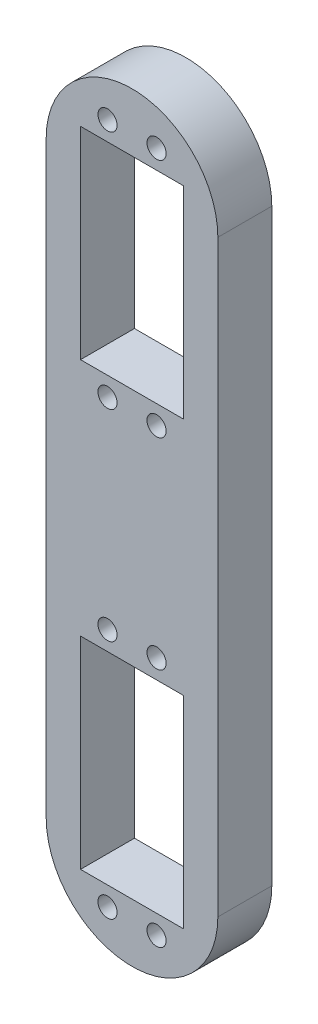
ISO-10303-21;
HEADER;
FILE_DESCRIPTION(('STEP AP214'),'2;1');
FILE_NAME('part.step','',(''),(''),'','','');
FILE_SCHEMA(('AUTOMOTIVE_DESIGN { 1 0 10303 214 1 1 1 1 }'));
ENDSEC;
DATA;
#1=APPLICATION_CONTEXT('core data for automotive mechanical design processes');
#2=APPLICATION_PROTOCOL_DEFINITION('international standard','automotive_design',2000,#1);
#3=PRODUCT_CONTEXT('',#1,'mechanical');
#4=PRODUCT('Part','Part','',(#3));
#5=PRODUCT_RELATED_PRODUCT_CATEGORY('part','',(#4));
#6=PRODUCT_DEFINITION_FORMATION('','',#4);
#7=PRODUCT_DEFINITION_CONTEXT('part definition',#1,'design');
#8=PRODUCT_DEFINITION('design','',#6,#7);
#9=PRODUCT_DEFINITION_SHAPE('','',#8);
#10=(LENGTH_UNIT() NAMED_UNIT(*) SI_UNIT(.MILLI.,.METRE.));
#11=(NAMED_UNIT(*) PLANE_ANGLE_UNIT() SI_UNIT($,.RADIAN.));
#12=(NAMED_UNIT(*) SI_UNIT($,.STERADIAN.) SOLID_ANGLE_UNIT());
#13=UNCERTAINTY_MEASURE_WITH_UNIT(LENGTH_MEASURE(1.E-05),#10,'distance_accuracy_value','');
#14=(GEOMETRIC_REPRESENTATION_CONTEXT(3) GLOBAL_UNCERTAINTY_ASSIGNED_CONTEXT((#13)) GLOBAL_UNIT_ASSIGNED_CONTEXT((#10,
#11,#12)) REPRESENTATION_CONTEXT('',''));
#15=CARTESIAN_POINT('',(0.,0.,0.));
#16=DIRECTION('',(0.,0.,1.));
#17=DIRECTION('',(1.,0.,0.));
#18=AXIS2_PLACEMENT_3D('',#15,#16,#17);
#19=CARTESIAN_POINT('',(-2.50000000000001,-50.,11.));
#20=DIRECTION('',(0.,0.,1.));
#21=DIRECTION('',(1.,0.,0.));
#22=AXIS2_PLACEMENT_3D('',#19,#20,#21);
#23=PLANE('',#22);
#24=CARTESIAN_POINT('',(2.49999999999998,-10.5,11.));
#25=DIRECTION('',(0.,0.,1.));
#26=DIRECTION('',(1.,0.,0.));
#27=AXIS2_PLACEMENT_3D('',#24,#25,#26);
#28=CIRCLE('',#27,1.95);
#29=CARTESIAN_POINT('',(4.44999999999998,-10.5,11.));
#30=VERTEX_POINT('',#29);
#31=EDGE_CURVE('E407',#30,#30,#28,.T.);
#32=ORIENTED_EDGE('',*,*,#31,.F.);
#33=EDGE_LOOP('',(#32));
#34=FACE_BOUND('',#33,.T.);
#35=CARTESIAN_POINT('',(-7.50000000000001,30.5,11.));
#36=DIRECTION('',(0.,0.,1.));
#37=DIRECTION('',(-1.,0.,0.));
#38=AXIS2_PLACEMENT_3D('',#35,#36,#37);
#39=CIRCLE('',#38,1.95);
#40=CARTESIAN_POINT('',(-9.45000000000001,30.5,11.));
#41=VERTEX_POINT('',#40);
#42=EDGE_CURVE('E406',#41,#41,#39,.T.);
#43=ORIENTED_EDGE('',*,*,#42,.F.);
#44=EDGE_LOOP('',(#43));
#45=FACE_BOUND('',#44,.T.);
#46=CARTESIAN_POINT('',(2.49999999999999,30.5,11.));
#47=DIRECTION('',(0.,0.,1.));
#48=DIRECTION('',(-1.,0.,0.));
#49=AXIS2_PLACEMENT_3D('',#46,#47,#48);
#50=CIRCLE('',#49,1.95);
#51=CARTESIAN_POINT('',(0.549999999999991,30.5,11.));
#52=VERTEX_POINT('',#51);
#53=EDGE_CURVE('E423',#52,#52,#50,.T.);
#54=ORIENTED_EDGE('',*,*,#53,.F.);
#55=EDGE_LOOP('',(#54));
#56=FACE_BOUND('',#55,.T.);
#57=CARTESIAN_POINT('',(2.49999999999999,79.5,11.));
#58=DIRECTION('',(0.,0.,1.));
#59=DIRECTION('',(1.,0.,0.));
#60=AXIS2_PLACEMENT_3D('',#57,#58,#59);
#61=CIRCLE('',#60,1.95);
#62=CARTESIAN_POINT('',(4.44999999999999,79.5,11.));
#63=VERTEX_POINT('',#62);
#64=EDGE_CURVE('E422',#63,#63,#61,.T.);
#65=ORIENTED_EDGE('',*,*,#64,.F.);
#66=EDGE_LOOP('',(#65));
#67=FACE_BOUND('',#66,.T.);
#68=CARTESIAN_POINT('',(-7.50000000000004,-59.4999999999999,11.));
#69=DIRECTION('',(0.,0.,1.));
#70=DIRECTION('',(-1.,0.,0.));
#71=AXIS2_PLACEMENT_3D('',#68,#69,#70);
#72=CIRCLE('',#71,1.95000000000001);
#73=CARTESIAN_POINT('',(-9.45000000000005,-59.4999999999999,11.));
#74=VERTEX_POINT('',#73);
#75=EDGE_CURVE('E378',#74,#74,#72,.T.);
#76=ORIENTED_EDGE('',*,*,#75,.F.);
#77=EDGE_LOOP('',(#76));
#78=FACE_BOUND('',#77,.T.);
#79=CARTESIAN_POINT('',(2.49999999999996,-59.4999999999999,11.));
#80=DIRECTION('',(0.,0.,1.));
#81=DIRECTION('',(-1.,0.,0.));
#82=AXIS2_PLACEMENT_3D('',#79,#80,#81);
#83=CIRCLE('',#82,1.95000000000001);
#84=CARTESIAN_POINT('',(0.549999999999956,-59.4999999999999,11.));
#85=VERTEX_POINT('',#84);
#86=EDGE_CURVE('E386',#85,#85,#83,.T.);
#87=ORIENTED_EDGE('',*,*,#86,.F.);
#88=EDGE_LOOP('',(#87));
#89=FACE_BOUND('',#88,.T.);
#90=CARTESIAN_POINT('',(-7.50000000000002,-10.5,11.));
#91=DIRECTION('',(0.,0.,1.));
#92=DIRECTION('',(1.,0.,0.));
#93=AXIS2_PLACEMENT_3D('',#90,#91,#92);
#94=CIRCLE('',#93,1.95);
#95=CARTESIAN_POINT('',(-5.55000000000002,-10.5,11.));
#96=VERTEX_POINT('',#95);
#97=EDGE_CURVE('E394',#96,#96,#94,.T.);
#98=ORIENTED_EDGE('',*,*,#97,.F.);
#99=EDGE_LOOP('',(#98));
#100=FACE_BOUND('',#99,.T.);
#101=CARTESIAN_POINT('',(-7.50000000000001,79.5,11.));
#102=DIRECTION('',(0.,0.,1.));
#103=DIRECTION('',(1.,0.,0.));
#104=AXIS2_PLACEMENT_3D('',#101,#102,#103);
#105=CIRCLE('',#104,1.95);
#106=CARTESIAN_POINT('',(-5.55000000000001,79.5,11.));
#107=VERTEX_POINT('',#106);
#108=EDGE_CURVE('E427',#107,#107,#105,.T.);
#109=ORIENTED_EDGE('',*,*,#108,.F.);
#110=EDGE_LOOP('',(#109));
#111=FACE_BOUND('',#110,.T.);
#112=DIRECTION('',(1.,0.,0.));
#113=VECTOR('',#112,1.);
#114=CARTESIAN_POINT('',(0.,-14.4,11.));
#115=LINE('',#114,#113);
#116=CARTESIAN_POINT('',(-13.,-14.4,11.));
#117=VERTEX_POINT('',#116);
#118=CARTESIAN_POINT('',(8.,-14.4,11.));
#119=VERTEX_POINT('',#118);
#120=EDGE_CURVE('E149',#117,#119,#115,.T.);
#121=ORIENTED_EDGE('',*,*,#120,.T.);
#122=DIRECTION('',(0.,-1.,0.));
#123=VECTOR('',#122,1.);
#124=CARTESIAN_POINT('',(8.,0.,11.));
#125=LINE('',#124,#123);
#126=CARTESIAN_POINT('',(7.99999999999998,-55.6,11.));
#127=VERTEX_POINT('',#126);
#128=EDGE_CURVE('E135',#119,#127,#125,.T.);
#129=ORIENTED_EDGE('',*,*,#128,.T.);
#130=DIRECTION('',(1.,0.,0.));
#131=VECTOR('',#130,1.);
#132=CARTESIAN_POINT('',(0.,-55.6,11.));
#133=LINE('',#132,#131);
#134=CARTESIAN_POINT('',(-13.,-55.6,11.));
#135=VERTEX_POINT('',#134);
#136=EDGE_CURVE('E169',#135,#127,#133,.T.);
#137=ORIENTED_EDGE('',*,*,#136,.F.);
#138=DIRECTION('',(0.,1.,0.));
#139=VECTOR('',#138,1.);
#140=CARTESIAN_POINT('',(-13.,0.,11.));
#141=LINE('',#140,#139);
#142=EDGE_CURVE('E157',#135,#117,#141,.T.);
#143=ORIENTED_EDGE('',*,*,#142,.T.);
#144=EDGE_LOOP('',(#121,#129,#137,#143));
#145=FACE_BOUND('',#144,.T.);
#146=CARTESIAN_POINT('',(-2.50000000000001,-50.,11.));
#147=DIRECTION('',(0.,0.,1.));
#148=DIRECTION('',(1.,0.,0.));
#149=AXIS2_PLACEMENT_3D('',#146,#147,#148);
#150=CIRCLE('',#149,17.5);
#151=CARTESIAN_POINT('',(-20.,-50.,11.));
#152=VERTEX_POINT('',#151);
#153=CARTESIAN_POINT('',(15.,-50.,11.));
#154=VERTEX_POINT('',#153);
#155=EDGE_CURVE('E225',#152,#154,#150,.T.);
#156=ORIENTED_EDGE('',*,*,#155,.T.);
#157=DIRECTION('',(0.,1.,0.));
#158=VECTOR('',#157,1.);
#159=CARTESIAN_POINT('',(15.,70.,11.));
#160=LINE('',#159,#158);
#161=CARTESIAN_POINT('',(15.,70.,11.));
#162=VERTEX_POINT('',#161);
#163=EDGE_CURVE('E229',#154,#162,#160,.T.);
#164=ORIENTED_EDGE('',*,*,#163,.T.);
#165=CARTESIAN_POINT('',(-2.50000000000001,70.,11.));
#166=DIRECTION('',(0.,0.,1.));
#167=DIRECTION('',(1.,0.,0.));
#168=AXIS2_PLACEMENT_3D('',#165,#166,#167);
#169=CIRCLE('',#168,17.5);
#170=CARTESIAN_POINT('',(-20.,70.,11.));
#171=VERTEX_POINT('',#170);
#172=EDGE_CURVE('E233',#162,#171,#169,.T.);
#173=ORIENTED_EDGE('',*,*,#172,.T.);
#174=DIRECTION('',(0.,-1.,0.));
#175=VECTOR('',#174,1.);
#176=CARTESIAN_POINT('',(-20.,70.,11.));
#177=LINE('',#176,#175);
#178=EDGE_CURVE('E236',#171,#152,#177,.T.);
#179=ORIENTED_EDGE('',*,*,#178,.T.);
#180=EDGE_LOOP('',(#156,#164,#173,#179));
#181=FACE_BOUND('',#180,.T.);
#182=DIRECTION('',(1.,0.,0.));
#183=VECTOR('',#182,1.);
#184=CARTESIAN_POINT('',(0.,75.6,11.));
#185=LINE('',#184,#183);
#186=CARTESIAN_POINT('',(-13.,75.6,11.));
#187=VERTEX_POINT('',#186);
#188=CARTESIAN_POINT('',(8.,75.6,11.));
#189=VERTEX_POINT('',#188);
#190=EDGE_CURVE('E186',#187,#189,#185,.T.);
#191=ORIENTED_EDGE('',*,*,#190,.T.);
#192=DIRECTION('',(0.,1.,0.));
#193=VECTOR('',#192,1.);
#194=CARTESIAN_POINT('',(7.99999999999999,75.5,11.));
#195=LINE('',#194,#193);
#196=CARTESIAN_POINT('',(8.00000000000001,34.4,11.));
#197=VERTEX_POINT('',#196);
#198=EDGE_CURVE('E216',#197,#189,#195,.T.);
#199=ORIENTED_EDGE('',*,*,#198,.F.);
#200=DIRECTION('',(1.,0.,0.));
#201=VECTOR('',#200,1.);
#202=CARTESIAN_POINT('',(0.,34.4,11.));
#203=LINE('',#202,#201);
#204=CARTESIAN_POINT('',(-13.,34.4,11.));
#205=VERTEX_POINT('',#204);
#206=EDGE_CURVE('E180',#205,#197,#203,.T.);
#207=ORIENTED_EDGE('',*,*,#206,.F.);
#208=DIRECTION('',(0.,-1.,0.));
#209=VECTOR('',#208,1.);
#210=CARTESIAN_POINT('',(-13.,75.5,11.));
#211=LINE('',#210,#209);
#212=EDGE_CURVE('E213',#187,#205,#211,.T.);
#213=ORIENTED_EDGE('',*,*,#212,.F.);
#214=EDGE_LOOP('',(#191,#199,#207,#213));
#215=FACE_BOUND('',#214,.T.);
#216=ADVANCED_FACE('F44',(#34,#45,#56,#67,#78,#89,#100,#111,#145,#181,#215),#23,.T.);
#217=CARTESIAN_POINT('',(-2.50000000000001,-50.,0.));
#218=DIRECTION('',(0.,0.,1.));
#219=DIRECTION('',(1.,0.,0.));
#220=AXIS2_PLACEMENT_3D('',#217,#218,#219);
#221=PLANE('',#220);
#222=CARTESIAN_POINT('',(2.49999999999998,-10.5,0.));
#223=DIRECTION('',(0.,0.,1.));
#224=DIRECTION('',(1.,0.,0.));
#225=AXIS2_PLACEMENT_3D('',#222,#223,#224);
#226=CIRCLE('',#225,1.95);
#227=CARTESIAN_POINT('',(4.44999999999998,-10.5,0.));
#228=VERTEX_POINT('',#227);
#229=EDGE_CURVE('E397',#228,#228,#226,.F.);
#230=ORIENTED_EDGE('',*,*,#229,.F.);
#231=EDGE_LOOP('',(#230));
#232=FACE_BOUND('',#231,.T.);
#233=CARTESIAN_POINT('',(-7.50000000000001,30.5,0.));
#234=DIRECTION('',(0.,0.,1.));
#235=DIRECTION('',(1.,0.,0.));
#236=AXIS2_PLACEMENT_3D('',#233,#234,#235);
#237=CIRCLE('',#236,1.95);
#238=CARTESIAN_POINT('',(-5.55000000000001,30.5,0.));
#239=VERTEX_POINT('',#238);
#240=EDGE_CURVE('E402',#239,#239,#237,.F.);
#241=ORIENTED_EDGE('',*,*,#240,.F.);
#242=EDGE_LOOP('',(#241));
#243=FACE_BOUND('',#242,.T.);
#244=CARTESIAN_POINT('',(2.49999999999999,30.5,0.));
#245=DIRECTION('',(0.,0.,1.));
#246=DIRECTION('',(1.,0.,0.));
#247=AXIS2_PLACEMENT_3D('',#244,#245,#246);
#248=CIRCLE('',#247,1.95);
#249=CARTESIAN_POINT('',(4.44999999999999,30.5,0.));
#250=VERTEX_POINT('',#249);
#251=EDGE_CURVE('E411',#250,#250,#248,.F.);
#252=ORIENTED_EDGE('',*,*,#251,.F.);
#253=EDGE_LOOP('',(#252));
#254=FACE_BOUND('',#253,.T.);
#255=CARTESIAN_POINT('',(2.49999999999999,79.5,0.));
#256=DIRECTION('',(0.,0.,1.));
#257=DIRECTION('',(1.,0.,0.));
#258=AXIS2_PLACEMENT_3D('',#255,#256,#257);
#259=CIRCLE('',#258,1.95);
#260=CARTESIAN_POINT('',(4.44999999999999,79.5,0.));
#261=VERTEX_POINT('',#260);
#262=EDGE_CURVE('E418',#261,#261,#259,.F.);
#263=ORIENTED_EDGE('',*,*,#262,.F.);
#264=EDGE_LOOP('',(#263));
#265=FACE_BOUND('',#264,.T.);
#266=CARTESIAN_POINT('',(-7.50000000000004,-59.4999999999999,0.));
#267=DIRECTION('',(0.,0.,1.));
#268=DIRECTION('',(1.,0.,0.));
#269=AXIS2_PLACEMENT_3D('',#266,#267,#268);
#270=CIRCLE('',#269,1.95000000000001);
#271=CARTESIAN_POINT('',(-5.55000000000003,-59.4999999999999,0.));
#272=VERTEX_POINT('',#271);
#273=EDGE_CURVE('E375',#272,#272,#270,.F.);
#274=ORIENTED_EDGE('',*,*,#273,.F.);
#275=EDGE_LOOP('',(#274));
#276=FACE_BOUND('',#275,.T.);
#277=CARTESIAN_POINT('',(2.49999999999996,-59.4999999999999,0.));
#278=DIRECTION('',(0.,0.,1.));
#279=DIRECTION('',(1.,0.,0.));
#280=AXIS2_PLACEMENT_3D('',#277,#278,#279);
#281=CIRCLE('',#280,1.95000000000001);
#282=CARTESIAN_POINT('',(4.44999999999997,-59.4999999999999,0.));
#283=VERTEX_POINT('',#282);
#284=EDGE_CURVE('E381',#283,#283,#281,.F.);
#285=ORIENTED_EDGE('',*,*,#284,.F.);
#286=EDGE_LOOP('',(#285));
#287=FACE_BOUND('',#286,.T.);
#288=CARTESIAN_POINT('',(-7.50000000000002,-10.5,0.));
#289=DIRECTION('',(0.,0.,1.));
#290=DIRECTION('',(1.,0.,0.));
#291=AXIS2_PLACEMENT_3D('',#288,#289,#290);
#292=CIRCLE('',#291,1.95);
#293=CARTESIAN_POINT('',(-5.55000000000002,-10.5,0.));
#294=VERTEX_POINT('',#293);
#295=EDGE_CURVE('E390',#294,#294,#292,.F.);
#296=ORIENTED_EDGE('',*,*,#295,.F.);
#297=EDGE_LOOP('',(#296));
#298=FACE_BOUND('',#297,.T.);
#299=CARTESIAN_POINT('',(-7.50000000000001,79.5,0.));
#300=DIRECTION('',(0.,0.,1.));
#301=DIRECTION('',(1.,0.,0.));
#302=AXIS2_PLACEMENT_3D('',#299,#300,#301);
#303=CIRCLE('',#302,1.95);
#304=CARTESIAN_POINT('',(-5.55000000000001,79.5,0.));
#305=VERTEX_POINT('',#304);
#306=EDGE_CURVE('E171',#305,#305,#303,.F.);
#307=ORIENTED_EDGE('',*,*,#306,.F.);
#308=EDGE_LOOP('',(#307));
#309=FACE_BOUND('',#308,.T.);
#310=DIRECTION('',(0.,-1.,0.));
#311=VECTOR('',#310,1.);
#312=CARTESIAN_POINT('',(8.,0.,0.));
#313=LINE('',#312,#311);
#314=CARTESIAN_POINT('',(8.,-14.4,0.));
#315=VERTEX_POINT('',#314);
#316=CARTESIAN_POINT('',(7.99999999999998,-55.6,0.));
#317=VERTEX_POINT('',#316);
#318=EDGE_CURVE('E159',#315,#317,#313,.T.);
#319=ORIENTED_EDGE('',*,*,#318,.F.);
#320=DIRECTION('',(1.,0.,0.));
#321=VECTOR('',#320,1.);
#322=CARTESIAN_POINT('',(0.,-14.4,0.));
#323=LINE('',#322,#321);
#324=CARTESIAN_POINT('',(-13.,-14.4,0.));
#325=VERTEX_POINT('',#324);
#326=EDGE_CURVE('E152',#325,#315,#323,.T.);
#327=ORIENTED_EDGE('',*,*,#326,.F.);
#328=DIRECTION('',(0.,1.,0.));
#329=VECTOR('',#328,1.);
#330=CARTESIAN_POINT('',(-13.,0.,0.));
#331=LINE('',#330,#329);
#332=CARTESIAN_POINT('',(-13.,-55.6,0.));
#333=VERTEX_POINT('',#332);
#334=EDGE_CURVE('E165',#333,#325,#331,.T.);
#335=ORIENTED_EDGE('',*,*,#334,.F.);
#336=DIRECTION('',(1.,0.,0.));
#337=VECTOR('',#336,1.);
#338=CARTESIAN_POINT('',(0.,-55.6,0.));
#339=LINE('',#338,#337);
#340=EDGE_CURVE('E68',#333,#317,#339,.T.);
#341=ORIENTED_EDGE('',*,*,#340,.T.);
#342=EDGE_LOOP('',(#319,#327,#335,#341));
#343=FACE_BOUND('',#342,.T.);
#344=CARTESIAN_POINT('',(-2.50000000000001,-50.,0.));
#345=DIRECTION('',(0.,0.,1.));
#346=DIRECTION('',(1.,0.,0.));
#347=AXIS2_PLACEMENT_3D('',#344,#345,#346);
#348=CIRCLE('',#347,17.5);
#349=CARTESIAN_POINT('',(-20.,-50.,0.));
#350=VERTEX_POINT('',#349);
#351=CARTESIAN_POINT('',(15.,-50.,0.));
#352=VERTEX_POINT('',#351);
#353=EDGE_CURVE('E220',#350,#352,#348,.T.);
#354=ORIENTED_EDGE('',*,*,#353,.F.);
#355=DIRECTION('',(0.,-1.,0.));
#356=VECTOR('',#355,1.);
#357=CARTESIAN_POINT('',(-20.,70.,0.));
#358=LINE('',#357,#356);
#359=CARTESIAN_POINT('',(-20.,70.,0.));
#360=VERTEX_POINT('',#359);
#361=EDGE_CURVE('E230',#360,#350,#358,.T.);
#362=ORIENTED_EDGE('',*,*,#361,.F.);
#363=CARTESIAN_POINT('',(-2.50000000000001,70.,0.));
#364=DIRECTION('',(0.,0.,1.));
#365=DIRECTION('',(1.,0.,0.));
#366=AXIS2_PLACEMENT_3D('',#363,#364,#365);
#367=CIRCLE('',#366,17.5);
#368=CARTESIAN_POINT('',(15.,70.,0.));
#369=VERTEX_POINT('',#368);
#370=EDGE_CURVE('E246',#369,#360,#367,.T.);
#371=ORIENTED_EDGE('',*,*,#370,.F.);
#372=DIRECTION('',(0.,1.,0.));
#373=VECTOR('',#372,1.);
#374=CARTESIAN_POINT('',(15.,70.,0.));
#375=LINE('',#374,#373);
#376=EDGE_CURVE('E243',#352,#369,#375,.T.);
#377=ORIENTED_EDGE('',*,*,#376,.F.);
#378=EDGE_LOOP('',(#354,#362,#371,#377));
#379=FACE_BOUND('',#378,.T.);
#380=DIRECTION('',(0.,1.,0.));
#381=VECTOR('',#380,1.);
#382=CARTESIAN_POINT('',(7.99999999999999,75.5,0.));
#383=LINE('',#382,#381);
#384=CARTESIAN_POINT('',(8.00000000000001,34.4,0.));
#385=VERTEX_POINT('',#384);
#386=CARTESIAN_POINT('',(8.,75.6,0.));
#387=VERTEX_POINT('',#386);
#388=EDGE_CURVE('E217',#385,#387,#383,.T.);
#389=ORIENTED_EDGE('',*,*,#388,.T.);
#390=DIRECTION('',(1.,0.,0.));
#391=VECTOR('',#390,1.);
#392=CARTESIAN_POINT('',(0.,75.6,0.));
#393=LINE('',#392,#391);
#394=CARTESIAN_POINT('',(-13.,75.6,0.));
#395=VERTEX_POINT('',#394);
#396=EDGE_CURVE('E181',#395,#387,#393,.T.);
#397=ORIENTED_EDGE('',*,*,#396,.F.);
#398=DIRECTION('',(0.,-1.,0.));
#399=VECTOR('',#398,1.);
#400=CARTESIAN_POINT('',(-13.,75.5,0.));
#401=LINE('',#400,#399);
#402=CARTESIAN_POINT('',(-13.,34.4,0.));
#403=VERTEX_POINT('',#402);
#404=EDGE_CURVE('E195',#395,#403,#401,.T.);
#405=ORIENTED_EDGE('',*,*,#404,.T.);
#406=DIRECTION('',(1.,0.,0.));
#407=VECTOR('',#406,1.);
#408=CARTESIAN_POINT('',(0.,34.4,0.));
#409=LINE('',#408,#407);
#410=EDGE_CURVE('E199',#403,#385,#409,.T.);
#411=ORIENTED_EDGE('',*,*,#410,.T.);
#412=EDGE_LOOP('',(#389,#397,#405,#411));
#413=FACE_BOUND('',#412,.T.);
#414=ADVANCED_FACE('F269',(#232,#243,#254,#265,#276,#287,#298,#309,#343,#379,#413),#221,.F.);
#415=CARTESIAN_POINT('',(-2.50000000000001,-50.,11.));
#416=DIRECTION('',(0.,0.,-1.));
#417=DIRECTION('',(-1.,0.,0.));
#418=AXIS2_PLACEMENT_3D('',#415,#416,#417);
#419=CYLINDRICAL_SURFACE('',#418,17.5);
#420=ORIENTED_EDGE('',*,*,#353,.T.);
#421=DIRECTION('',(0.,0.,-1.));
#422=VECTOR('',#421,1.);
#423=CARTESIAN_POINT('',(15.,-50.,11.));
#424=LINE('',#423,#422);
#425=EDGE_CURVE('E11',#154,#352,#424,.T.);
#426=ORIENTED_EDGE('',*,*,#425,.F.);
#427=ORIENTED_EDGE('',*,*,#155,.F.);
#428=DIRECTION('',(0.,0.,-1.));
#429=VECTOR('',#428,1.);
#430=CARTESIAN_POINT('',(-20.,-50.,11.));
#431=LINE('',#430,#429);
#432=EDGE_CURVE('E239',#152,#350,#431,.T.);
#433=ORIENTED_EDGE('',*,*,#432,.T.);
#434=EDGE_LOOP('',(#420,#426,#427,#433));
#435=FACE_BOUND('',#434,.T.);
#436=ADVANCED_FACE('F46',(#435),#419,.T.);
#437=CARTESIAN_POINT('',(15.,70.,11.));
#438=DIRECTION('',(-1.,0.,0.));
#439=DIRECTION('',(0.,0.,1.));
#440=AXIS2_PLACEMENT_3D('',#437,#438,#439);
#441=PLANE('',#440);
#442=ORIENTED_EDGE('',*,*,#376,.T.);
#443=DIRECTION('',(0.,0.,-1.));
#444=VECTOR('',#443,1.);
#445=CARTESIAN_POINT('',(15.,70.,11.));
#446=LINE('',#445,#444);
#447=EDGE_CURVE('E53',#162,#369,#446,.T.);
#448=ORIENTED_EDGE('',*,*,#447,.F.);
#449=ORIENTED_EDGE('',*,*,#163,.F.);
#450=ORIENTED_EDGE('',*,*,#425,.T.);
#451=EDGE_LOOP('',(#442,#448,#449,#450));
#452=FACE_BOUND('',#451,.T.);
#453=ADVANCED_FACE('F279',(#452),#441,.F.);
#454=CARTESIAN_POINT('',(-2.50000000000001,70.,11.));
#455=DIRECTION('',(0.,0.,-1.));
#456=DIRECTION('',(-1.,0.,0.));
#457=AXIS2_PLACEMENT_3D('',#454,#455,#456);
#458=CYLINDRICAL_SURFACE('',#457,17.5);
#459=ORIENTED_EDGE('',*,*,#370,.T.);
#460=DIRECTION('',(0.,0.,-1.));
#461=VECTOR('',#460,1.);
#462=CARTESIAN_POINT('',(-20.,70.,11.));
#463=LINE('',#462,#461);
#464=EDGE_CURVE('E254',#171,#360,#463,.T.);
#465=ORIENTED_EDGE('',*,*,#464,.F.);
#466=ORIENTED_EDGE('',*,*,#172,.F.);
#467=ORIENTED_EDGE('',*,*,#447,.T.);
#468=EDGE_LOOP('',(#459,#465,#466,#467));
#469=FACE_BOUND('',#468,.T.);
#470=ADVANCED_FACE('F263',(#469),#458,.T.);
#471=CARTESIAN_POINT('',(-20.,70.,11.));
#472=DIRECTION('',(1.,0.,0.));
#473=DIRECTION('',(0.,0.,-1.));
#474=AXIS2_PLACEMENT_3D('',#471,#472,#473);
#475=PLANE('',#474);
#476=ORIENTED_EDGE('',*,*,#361,.T.);
#477=ORIENTED_EDGE('',*,*,#432,.F.);
#478=ORIENTED_EDGE('',*,*,#178,.F.);
#479=ORIENTED_EDGE('',*,*,#464,.T.);
#480=EDGE_LOOP('',(#476,#477,#478,#479));
#481=FACE_BOUND('',#480,.T.);
#482=ADVANCED_FACE('F273',(#481),#475,.F.);
#483=CARTESIAN_POINT('',(-13.,75.5,11.));
#484=DIRECTION('',(1.,0.,0.));
#485=DIRECTION('',(0.,1.,0.));
#486=AXIS2_PLACEMENT_3D('',#483,#484,#485);
#487=PLANE('',#486);
#488=ORIENTED_EDGE('',*,*,#404,.F.);
#489=DIRECTION('',(0.,0.,1.));
#490=VECTOR('',#489,1.);
#491=CARTESIAN_POINT('',(-13.,75.6,0.));
#492=LINE('',#491,#490);
#493=EDGE_CURVE('E191',#395,#187,#492,.T.);
#494=ORIENTED_EDGE('',*,*,#493,.T.);
#495=ORIENTED_EDGE('',*,*,#212,.T.);
#496=DIRECTION('',(0.,0.,1.));
#497=VECTOR('',#496,1.);
#498=CARTESIAN_POINT('',(-13.,34.4,0.));
#499=LINE('',#498,#497);
#500=EDGE_CURVE('E203',#403,#205,#499,.T.);
#501=ORIENTED_EDGE('',*,*,#500,.F.);
#502=EDGE_LOOP('',(#488,#494,#495,#501));
#503=FACE_BOUND('',#502,.T.);
#504=ADVANCED_FACE('F297',(#503),#487,.T.);
#505=CARTESIAN_POINT('',(7.99999999999999,75.5,11.));
#506=DIRECTION('',(-1.,0.,0.));
#507=DIRECTION('',(0.,-1.,0.));
#508=AXIS2_PLACEMENT_3D('',#505,#506,#507);
#509=PLANE('',#508);
#510=ORIENTED_EDGE('',*,*,#388,.F.);
#511=DIRECTION('',(0.,0.,1.));
#512=VECTOR('',#511,1.);
#513=CARTESIAN_POINT('',(8.00000000000001,34.4,0.));
#514=LINE('',#513,#512);
#515=EDGE_CURVE('E190',#385,#197,#514,.T.);
#516=ORIENTED_EDGE('',*,*,#515,.T.);
#517=ORIENTED_EDGE('',*,*,#198,.T.);
#518=DIRECTION('',(0.,0.,1.));
#519=VECTOR('',#518,1.);
#520=CARTESIAN_POINT('',(8.,75.6,0.));
#521=LINE('',#520,#519);
#522=EDGE_CURVE('E185',#387,#189,#521,.T.);
#523=ORIENTED_EDGE('',*,*,#522,.F.);
#524=EDGE_LOOP('',(#510,#516,#517,#523));
#525=FACE_BOUND('',#524,.T.);
#526=ADVANCED_FACE('F304',(#525),#509,.T.);
#527=CARTESIAN_POINT('',(0.,75.6,0.));
#528=DIRECTION('',(0.,-1.,0.));
#529=DIRECTION('',(0.,0.,-1.));
#530=AXIS2_PLACEMENT_3D('',#527,#528,#529);
#531=PLANE('',#530);
#532=ORIENTED_EDGE('',*,*,#190,.F.);
#533=ORIENTED_EDGE('',*,*,#493,.F.);
#534=ORIENTED_EDGE('',*,*,#396,.T.);
#535=ORIENTED_EDGE('',*,*,#522,.T.);
#536=EDGE_LOOP('',(#532,#533,#534,#535));
#537=FACE_BOUND('',#536,.T.);
#538=ADVANCED_FACE('F309',(#537),#531,.T.);
#539=CARTESIAN_POINT('',(0.,34.4,0.));
#540=DIRECTION('',(0.,-1.,0.));
#541=DIRECTION('',(0.,0.,-1.));
#542=AXIS2_PLACEMENT_3D('',#539,#540,#541);
#543=PLANE('',#542);
#544=ORIENTED_EDGE('',*,*,#206,.T.);
#545=ORIENTED_EDGE('',*,*,#515,.F.);
#546=ORIENTED_EDGE('',*,*,#410,.F.);
#547=ORIENTED_EDGE('',*,*,#500,.T.);
#548=EDGE_LOOP('',(#544,#545,#546,#547));
#549=FACE_BOUND('',#548,.T.);
#550=ADVANCED_FACE('F320',(#549),#543,.F.);
#551=CARTESIAN_POINT('',(0.,-14.4,57.2432697805854));
#552=DIRECTION('',(0.,1.,0.));
#553=DIRECTION('',(-1.,0.,0.));
#554=AXIS2_PLACEMENT_3D('',#551,#552,#553);
#555=PLANE('',#554);
#556=DIRECTION('',(0.,0.,-1.));
#557=VECTOR('',#556,1.);
#558=CARTESIAN_POINT('',(-13.,-14.4,57.2432697805854));
#559=LINE('',#558,#557);
#560=EDGE_CURVE('E60',#117,#325,#559,.T.);
#561=ORIENTED_EDGE('',*,*,#560,.T.);
#562=ORIENTED_EDGE('',*,*,#326,.T.);
#563=DIRECTION('',(0.,0.,-1.));
#564=VECTOR('',#563,1.);
#565=CARTESIAN_POINT('',(8.,-14.4,57.2432697805854));
#566=LINE('',#565,#564);
#567=EDGE_CURVE('E139',#119,#315,#566,.T.);
#568=ORIENTED_EDGE('',*,*,#567,.F.);
#569=ORIENTED_EDGE('',*,*,#120,.F.);
#570=EDGE_LOOP('',(#561,#562,#568,#569));
#571=FACE_BOUND('',#570,.T.);
#572=ADVANCED_FACE('F148',(#571),#555,.F.);
#573=CARTESIAN_POINT('',(8.,0.,57.2432697805854));
#574=DIRECTION('',(1.,0.,0.));
#575=DIRECTION('',(0.,1.,0.));
#576=AXIS2_PLACEMENT_3D('',#573,#574,#575);
#577=PLANE('',#576);
#578=ORIENTED_EDGE('',*,*,#567,.T.);
#579=ORIENTED_EDGE('',*,*,#318,.T.);
#580=DIRECTION('',(0.,0.,-1.));
#581=VECTOR('',#580,1.);
#582=CARTESIAN_POINT('',(7.99999999999998,-55.6,57.2432697805854));
#583=LINE('',#582,#581);
#584=EDGE_CURVE('E141',#127,#317,#583,.T.);
#585=ORIENTED_EDGE('',*,*,#584,.F.);
#586=ORIENTED_EDGE('',*,*,#128,.F.);
#587=EDGE_LOOP('',(#578,#579,#585,#586));
#588=FACE_BOUND('',#587,.T.);
#589=ADVANCED_FACE('F137',(#588),#577,.F.);
#590=CARTESIAN_POINT('',(0.,-55.6,57.2432697805854));
#591=DIRECTION('',(0.,1.,0.));
#592=DIRECTION('',(0.,0.,1.));
#593=AXIS2_PLACEMENT_3D('',#590,#591,#592);
#594=PLANE('',#593);
#595=ORIENTED_EDGE('',*,*,#136,.T.);
#596=ORIENTED_EDGE('',*,*,#584,.T.);
#597=ORIENTED_EDGE('',*,*,#340,.F.);
#598=DIRECTION('',(0.,0.,-1.));
#599=VECTOR('',#598,1.);
#600=CARTESIAN_POINT('',(-13.,-55.6,57.2432697805854));
#601=LINE('',#600,#599);
#602=EDGE_CURVE('E173',#135,#333,#601,.T.);
#603=ORIENTED_EDGE('',*,*,#602,.F.);
#604=EDGE_LOOP('',(#595,#596,#597,#603));
#605=FACE_BOUND('',#604,.T.);
#606=ADVANCED_FACE('F333',(#605),#594,.T.);
#607=CARTESIAN_POINT('',(-13.,0.,57.2432697805854));
#608=DIRECTION('',(-1.,0.,0.));
#609=DIRECTION('',(0.,-1.,0.));
#610=AXIS2_PLACEMENT_3D('',#607,#608,#609);
#611=PLANE('',#610);
#612=ORIENTED_EDGE('',*,*,#602,.T.);
#613=ORIENTED_EDGE('',*,*,#334,.T.);
#614=ORIENTED_EDGE('',*,*,#560,.F.);
#615=ORIENTED_EDGE('',*,*,#142,.F.);
#616=EDGE_LOOP('',(#612,#613,#614,#615));
#617=FACE_BOUND('',#616,.T.);
#618=ADVANCED_FACE('F336',(#617),#611,.F.);
#619=CARTESIAN_POINT('',(-7.50000000000001,79.5,-5.51543289325509));
#620=DIRECTION('',(0.,0.,1.));
#621=DIRECTION('',(1.,0.,0.));
#622=AXIS2_PLACEMENT_3D('',#619,#620,#621);
#623=CYLINDRICAL_SURFACE('',#622,1.95);
#624=ORIENTED_EDGE('',*,*,#306,.T.);
#625=EDGE_LOOP('',(#624));
#626=FACE_BOUND('',#625,.T.);
#627=ORIENTED_EDGE('',*,*,#108,.T.);
#628=EDGE_LOOP('',(#627));
#629=FACE_BOUND('',#628,.T.);
#630=ADVANCED_FACE('F339',(#626,#629),#623,.F.);
#631=CARTESIAN_POINT('',(-7.50000000000002,-10.5,-5.51543289325509));
#632=DIRECTION('',(0.,0.,1.));
#633=DIRECTION('',(1.,0.,0.));
#634=AXIS2_PLACEMENT_3D('',#631,#632,#633);
#635=CYLINDRICAL_SURFACE('',#634,1.95);
#636=ORIENTED_EDGE('',*,*,#295,.T.);
#637=EDGE_LOOP('',(#636));
#638=FACE_BOUND('',#637,.T.);
#639=ORIENTED_EDGE('',*,*,#97,.T.);
#640=EDGE_LOOP('',(#639));
#641=FACE_BOUND('',#640,.T.);
#642=ADVANCED_FACE('F342',(#638,#641),#635,.F.);
#643=CARTESIAN_POINT('',(2.49999999999996,-59.4999999999999,-5.51543289325509));
#644=DIRECTION('',(0.,0.,1.));
#645=DIRECTION('',(1.,0.,0.));
#646=AXIS2_PLACEMENT_3D('',#643,#644,#645);
#647=CYLINDRICAL_SURFACE('',#646,1.95000000000001);
#648=ORIENTED_EDGE('',*,*,#284,.T.);
#649=EDGE_LOOP('',(#648));
#650=FACE_BOUND('',#649,.T.);
#651=ORIENTED_EDGE('',*,*,#86,.T.);
#652=EDGE_LOOP('',(#651));
#653=FACE_BOUND('',#652,.T.);
#654=ADVANCED_FACE('F361',(#650,#653),#647,.F.);
#655=CARTESIAN_POINT('',(-7.50000000000004,-59.4999999999999,-5.51543289325509));
#656=DIRECTION('',(0.,0.,1.));
#657=DIRECTION('',(1.,0.,0.));
#658=AXIS2_PLACEMENT_3D('',#655,#656,#657);
#659=CYLINDRICAL_SURFACE('',#658,1.95000000000001);
#660=ORIENTED_EDGE('',*,*,#273,.T.);
#661=EDGE_LOOP('',(#660));
#662=FACE_BOUND('',#661,.T.);
#663=ORIENTED_EDGE('',*,*,#75,.T.);
#664=EDGE_LOOP('',(#663));
#665=FACE_BOUND('',#664,.T.);
#666=ADVANCED_FACE('F352',(#662,#665),#659,.F.);
#667=CARTESIAN_POINT('',(2.49999999999999,79.5,-5.51543289325509));
#668=DIRECTION('',(0.,0.,1.));
#669=DIRECTION('',(1.,0.,0.));
#670=AXIS2_PLACEMENT_3D('',#667,#668,#669);
#671=CYLINDRICAL_SURFACE('',#670,1.95);
#672=ORIENTED_EDGE('',*,*,#262,.T.);
#673=EDGE_LOOP('',(#672));
#674=FACE_BOUND('',#673,.T.);
#675=ORIENTED_EDGE('',*,*,#64,.T.);
#676=EDGE_LOOP('',(#675));
#677=FACE_BOUND('',#676,.T.);
#678=ADVANCED_FACE('F348',(#674,#677),#671,.F.);
#679=CARTESIAN_POINT('',(2.49999999999999,30.5,-5.51543289325509));
#680=DIRECTION('',(0.,0.,1.));
#681=DIRECTION('',(1.,0.,0.));
#682=AXIS2_PLACEMENT_3D('',#679,#680,#681);
#683=CYLINDRICAL_SURFACE('',#682,1.95);
#684=ORIENTED_EDGE('',*,*,#251,.T.);
#685=EDGE_LOOP('',(#684));
#686=FACE_BOUND('',#685,.T.);
#687=ORIENTED_EDGE('',*,*,#53,.T.);
#688=EDGE_LOOP('',(#687));
#689=FACE_BOUND('',#688,.T.);
#690=ADVANCED_FACE('F344',(#686,#689),#683,.F.);
#691=CARTESIAN_POINT('',(-7.50000000000001,30.5,-5.51543289325509));
#692=DIRECTION('',(0.,0.,1.));
#693=DIRECTION('',(1.,0.,0.));
#694=AXIS2_PLACEMENT_3D('',#691,#692,#693);
#695=CYLINDRICAL_SURFACE('',#694,1.95);
#696=ORIENTED_EDGE('',*,*,#240,.T.);
#697=EDGE_LOOP('',(#696));
#698=FACE_BOUND('',#697,.T.);
#699=ORIENTED_EDGE('',*,*,#42,.T.);
#700=EDGE_LOOP('',(#699));
#701=FACE_BOUND('',#700,.T.);
#702=ADVANCED_FACE('F347',(#698,#701),#695,.F.);
#703=CARTESIAN_POINT('',(2.49999999999998,-10.5,-5.51543289325509));
#704=DIRECTION('',(0.,0.,1.));
#705=DIRECTION('',(1.,0.,0.));
#706=AXIS2_PLACEMENT_3D('',#703,#704,#705);
#707=CYLINDRICAL_SURFACE('',#706,1.95);
#708=ORIENTED_EDGE('',*,*,#229,.T.);
#709=EDGE_LOOP('',(#708));
#710=FACE_BOUND('',#709,.T.);
#711=ORIENTED_EDGE('',*,*,#31,.T.);
#712=EDGE_LOOP('',(#711));
#713=FACE_BOUND('',#712,.T.);
#714=ADVANCED_FACE('F354',(#710,#713),#707,.F.);
#715=CLOSED_SHELL('',(#216,#414,#436,#453,#470,#482,#504,#526,#538,#550,#572,#589,#606,#618,
#630,#642,#654,#666,#678,#690,#702,#714));
#716=MANIFOLD_SOLID_BREP('B2',#715);
#717=ADVANCED_BREP_SHAPE_REPRESENTATION('',(#18,#716),#14);
#718=SHAPE_DEFINITION_REPRESENTATION(#9,#717);
ENDSEC;
END-ISO-10303-21;
